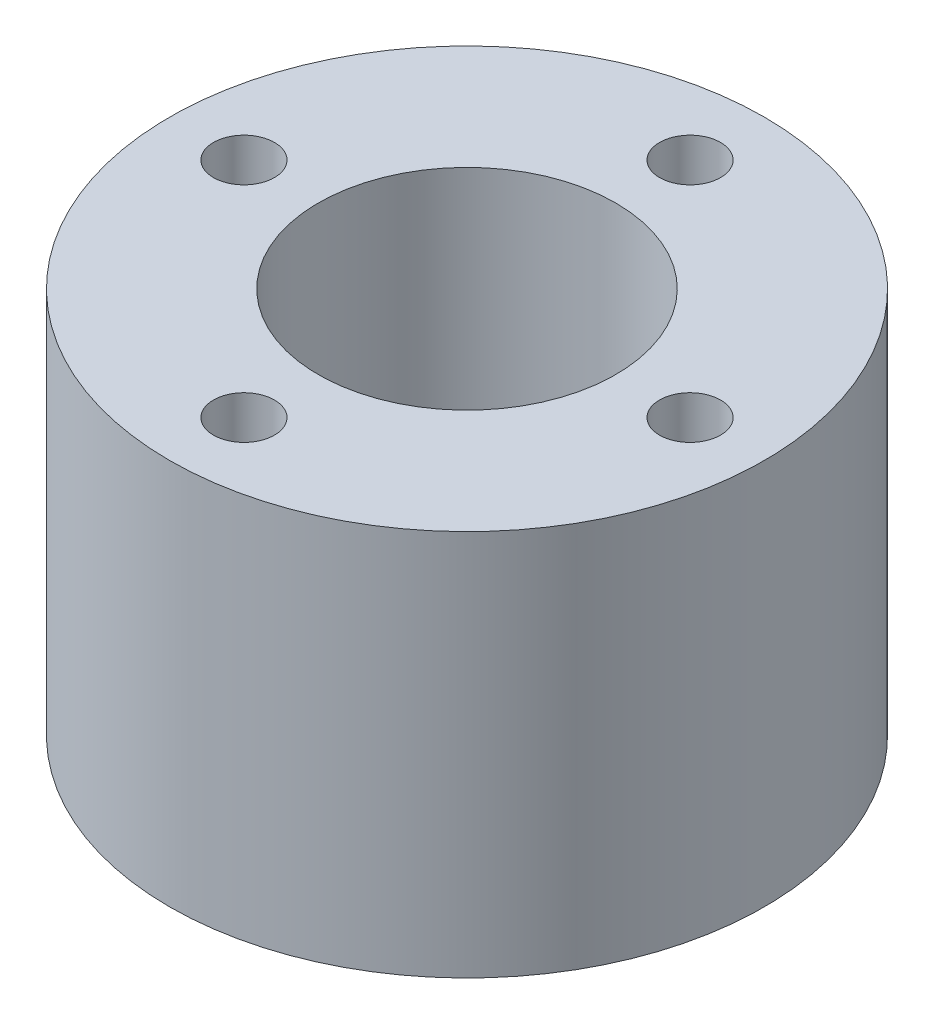
ISO-10303-21;
HEADER;
FILE_DESCRIPTION(('STEP AP214'),'2;1');
FILE_NAME('part.step','',(''),(''),'','','');
FILE_SCHEMA(('AUTOMOTIVE_DESIGN { 1 0 10303 214 1 1 1 1 }'));
ENDSEC;
DATA;
#1=APPLICATION_CONTEXT('core data for automotive mechanical design processes');
#2=APPLICATION_PROTOCOL_DEFINITION('international standard','automotive_design',2000,#1);
#3=PRODUCT_CONTEXT('',#1,'mechanical');
#4=PRODUCT('Part','Part','',(#3));
#5=PRODUCT_RELATED_PRODUCT_CATEGORY('part','',(#4));
#6=PRODUCT_DEFINITION_FORMATION('','',#4);
#7=PRODUCT_DEFINITION_CONTEXT('part definition',#1,'design');
#8=PRODUCT_DEFINITION('design','',#6,#7);
#9=PRODUCT_DEFINITION_SHAPE('','',#8);
#10=(LENGTH_UNIT() NAMED_UNIT(*) SI_UNIT(.MILLI.,.METRE.));
#11=(NAMED_UNIT(*) PLANE_ANGLE_UNIT() SI_UNIT($,.RADIAN.));
#12=(NAMED_UNIT(*) SI_UNIT($,.STERADIAN.) SOLID_ANGLE_UNIT());
#13=UNCERTAINTY_MEASURE_WITH_UNIT(LENGTH_MEASURE(1.E-05),#10,'distance_accuracy_value','');
#14=(GEOMETRIC_REPRESENTATION_CONTEXT(3) GLOBAL_UNCERTAINTY_ASSIGNED_CONTEXT((#13)) GLOBAL_UNIT_ASSIGNED_CONTEXT((#10,
#11,#12)) REPRESENTATION_CONTEXT('',''));
#15=CARTESIAN_POINT('',(0.,0.,0.));
#16=DIRECTION('',(0.,0.,1.));
#17=DIRECTION('',(1.,0.,0.));
#18=AXIS2_PLACEMENT_3D('',#15,#16,#17);
#19=CARTESIAN_POINT('',(-7.5,0.999999999999998,0.));
#20=DIRECTION('',(0.,-1.,0.));
#21=DIRECTION('',(0.,0.,-1.));
#22=AXIS2_PLACEMENT_3D('',#19,#20,#21);
#23=PLANE('',#22);
#24=CARTESIAN_POINT('',(-7.5,0.999999999999999,0.));
#25=DIRECTION('',(0.,1.,0.));
#26=DIRECTION('',(0.,0.,1.));
#27=AXIS2_PLACEMENT_3D('',#24,#25,#26);
#28=CIRCLE('',#27,1.025);
#29=CARTESIAN_POINT('',(-7.5,0.999999999999999,1.025));
#30=VERTEX_POINT('',#29);
#31=EDGE_CURVE('E17',#30,#30,#28,.T.);
#32=ORIENTED_EDGE('',*,*,#31,.T.);
#33=EDGE_LOOP('',(#32));
#34=FACE_BOUND('',#33,.T.);
#35=ADVANCED_FACE('F14',(#34),#23,.F.);
#36=CARTESIAN_POINT('',(0.,0.999999999999998,7.5));
#37=DIRECTION('',(0.,-1.,0.));
#38=DIRECTION('',(0.,0.,-1.));
#39=AXIS2_PLACEMENT_3D('',#36,#37,#38);
#40=PLANE('',#39);
#41=CARTESIAN_POINT('',(0.,0.999999999999999,7.5));
#42=DIRECTION('',(0.,1.,0.));
#43=DIRECTION('',(0.,0.,1.));
#44=AXIS2_PLACEMENT_3D('',#41,#42,#43);
#45=CIRCLE('',#44,1.025);
#46=CARTESIAN_POINT('',(0.,0.999999999999999,8.525));
#47=VERTEX_POINT('',#46);
#48=EDGE_CURVE('E51',#47,#47,#45,.T.);
#49=ORIENTED_EDGE('',*,*,#48,.T.);
#50=EDGE_LOOP('',(#49));
#51=FACE_BOUND('',#50,.T.);
#52=ADVANCED_FACE('F109',(#51),#40,.F.);
#53=CARTESIAN_POINT('',(7.5,0.999999999999998,0.));
#54=DIRECTION('',(0.,-1.,0.));
#55=DIRECTION('',(0.,0.,-1.));
#56=AXIS2_PLACEMENT_3D('',#53,#54,#55);
#57=PLANE('',#56);
#58=CARTESIAN_POINT('',(7.5,0.999999999999999,0.));
#59=DIRECTION('',(0.,1.,0.));
#60=DIRECTION('',(0.,0.,1.));
#61=AXIS2_PLACEMENT_3D('',#58,#59,#60);
#62=CIRCLE('',#61,1.025);
#63=CARTESIAN_POINT('',(7.5,0.999999999999999,1.025));
#64=VERTEX_POINT('',#63);
#65=EDGE_CURVE('E49',#64,#64,#62,.T.);
#66=ORIENTED_EDGE('',*,*,#65,.T.);
#67=EDGE_LOOP('',(#66));
#68=FACE_BOUND('',#67,.T.);
#69=ADVANCED_FACE('F73',(#68),#57,.F.);
#70=CARTESIAN_POINT('',(0.,0.999999999999998,-7.5));
#71=DIRECTION('',(0.,-1.,0.));
#72=DIRECTION('',(0.,0.,-1.));
#73=AXIS2_PLACEMENT_3D('',#70,#71,#72);
#74=PLANE('',#73);
#75=CARTESIAN_POINT('',(0.,0.999999999999999,-7.5));
#76=DIRECTION('',(0.,1.,0.));
#77=DIRECTION('',(0.,0.,1.));
#78=AXIS2_PLACEMENT_3D('',#75,#76,#77);
#79=CIRCLE('',#78,1.025);
#80=CARTESIAN_POINT('',(0.,0.999999999999999,-6.475));
#81=VERTEX_POINT('',#80);
#82=EDGE_CURVE('E46',#81,#81,#79,.T.);
#83=ORIENTED_EDGE('',*,*,#82,.T.);
#84=EDGE_LOOP('',(#83));
#85=FACE_BOUND('',#84,.T.);
#86=ADVANCED_FACE('F62',(#85),#74,.F.);
#87=CARTESIAN_POINT('',(-7.5,13.,0.));
#88=DIRECTION('',(0.,1.,0.));
#89=DIRECTION('',(0.,0.,1.));
#90=AXIS2_PLACEMENT_3D('',#87,#88,#89);
#91=CYLINDRICAL_SURFACE('',#90,1.025);
#92=CARTESIAN_POINT('',(-7.5,13.,0.));
#93=DIRECTION('',(0.,1.,0.));
#94=DIRECTION('',(0.,0.,1.));
#95=AXIS2_PLACEMENT_3D('',#92,#93,#94);
#96=CIRCLE('',#95,1.025);
#97=CARTESIAN_POINT('',(-7.5,13.,1.025));
#98=VERTEX_POINT('',#97);
#99=EDGE_CURVE('E43',#98,#98,#96,.F.);
#100=ORIENTED_EDGE('',*,*,#99,.F.);
#101=EDGE_LOOP('',(#100));
#102=FACE_BOUND('',#101,.T.);
#103=ORIENTED_EDGE('',*,*,#31,.F.);
#104=EDGE_LOOP('',(#103));
#105=FACE_BOUND('',#104,.T.);
#106=ADVANCED_FACE('F59',(#102,#105),#91,.F.);
#107=CARTESIAN_POINT('',(0.,13.,7.5));
#108=DIRECTION('',(0.,1.,0.));
#109=DIRECTION('',(0.,0.,1.));
#110=AXIS2_PLACEMENT_3D('',#107,#108,#109);
#111=CYLINDRICAL_SURFACE('',#110,1.025);
#112=CARTESIAN_POINT('',(0.,13.,7.5));
#113=DIRECTION('',(0.,1.,0.));
#114=DIRECTION('',(0.,0.,1.));
#115=AXIS2_PLACEMENT_3D('',#112,#113,#114);
#116=CIRCLE('',#115,1.025);
#117=CARTESIAN_POINT('',(0.,13.,8.525));
#118=VERTEX_POINT('',#117);
#119=EDGE_CURVE('E40',#118,#118,#116,.F.);
#120=ORIENTED_EDGE('',*,*,#119,.F.);
#121=EDGE_LOOP('',(#120));
#122=FACE_BOUND('',#121,.T.);
#123=ORIENTED_EDGE('',*,*,#48,.F.);
#124=EDGE_LOOP('',(#123));
#125=FACE_BOUND('',#124,.T.);
#126=ADVANCED_FACE('F61',(#122,#125),#111,.F.);
#127=CARTESIAN_POINT('',(7.5,13.,0.));
#128=DIRECTION('',(0.,1.,0.));
#129=DIRECTION('',(0.,0.,1.));
#130=AXIS2_PLACEMENT_3D('',#127,#128,#129);
#131=CYLINDRICAL_SURFACE('',#130,1.025);
#132=CARTESIAN_POINT('',(7.5,13.,0.));
#133=DIRECTION('',(0.,1.,0.));
#134=DIRECTION('',(0.,0.,1.));
#135=AXIS2_PLACEMENT_3D('',#132,#133,#134);
#136=CIRCLE('',#135,1.025);
#137=CARTESIAN_POINT('',(7.5,13.,1.025));
#138=VERTEX_POINT('',#137);
#139=EDGE_CURVE('E37',#138,#138,#136,.F.);
#140=ORIENTED_EDGE('',*,*,#139,.F.);
#141=EDGE_LOOP('',(#140));
#142=FACE_BOUND('',#141,.T.);
#143=ORIENTED_EDGE('',*,*,#65,.F.);
#144=EDGE_LOOP('',(#143));
#145=FACE_BOUND('',#144,.T.);
#146=ADVANCED_FACE('F70',(#142,#145),#131,.F.);
#147=CARTESIAN_POINT('',(0.,13.,-7.5));
#148=DIRECTION('',(0.,1.,0.));
#149=DIRECTION('',(0.,0.,1.));
#150=AXIS2_PLACEMENT_3D('',#147,#148,#149);
#151=CYLINDRICAL_SURFACE('',#150,1.025);
#152=CARTESIAN_POINT('',(0.,13.,-7.5));
#153=DIRECTION('',(0.,1.,0.));
#154=DIRECTION('',(0.,0.,1.));
#155=AXIS2_PLACEMENT_3D('',#152,#153,#154);
#156=CIRCLE('',#155,1.025);
#157=CARTESIAN_POINT('',(0.,13.,-6.475));
#158=VERTEX_POINT('',#157);
#159=EDGE_CURVE('E34',#158,#158,#156,.F.);
#160=ORIENTED_EDGE('',*,*,#159,.F.);
#161=EDGE_LOOP('',(#160));
#162=FACE_BOUND('',#161,.T.);
#163=ORIENTED_EDGE('',*,*,#82,.F.);
#164=EDGE_LOOP('',(#163));
#165=FACE_BOUND('',#164,.T.);
#166=ADVANCED_FACE('F95',(#162,#165),#151,.F.);
#167=CARTESIAN_POINT('',(0.,13.,0.));
#168=DIRECTION('',(0.,-1.,0.));
#169=DIRECTION('',(0.,0.,-1.));
#170=AXIS2_PLACEMENT_3D('',#167,#168,#169);
#171=CYLINDRICAL_SURFACE('',#170,5.);
#172=CARTESIAN_POINT('',(0.,0.,0.));
#173=DIRECTION('',(0.,-1.,0.));
#174=DIRECTION('',(0.,0.,-1.));
#175=AXIS2_PLACEMENT_3D('',#172,#173,#174);
#176=CIRCLE('',#175,5.);
#177=CARTESIAN_POINT('',(0.,0.,-5.));
#178=VERTEX_POINT('',#177);
#179=EDGE_CURVE('E26',#178,#178,#176,.T.);
#180=ORIENTED_EDGE('',*,*,#179,.T.);
#181=EDGE_LOOP('',(#180));
#182=FACE_BOUND('',#181,.T.);
#183=CARTESIAN_POINT('',(0.,13.,0.));
#184=DIRECTION('',(0.,-1.,0.));
#185=DIRECTION('',(0.,0.,-1.));
#186=AXIS2_PLACEMENT_3D('',#183,#184,#185);
#187=CIRCLE('',#186,5.);
#188=CARTESIAN_POINT('',(0.,13.,-5.));
#189=VERTEX_POINT('',#188);
#190=EDGE_CURVE('E31',#189,#189,#187,.T.);
#191=ORIENTED_EDGE('',*,*,#190,.F.);
#192=EDGE_LOOP('',(#191));
#193=FACE_BOUND('',#192,.T.);
#194=ADVANCED_FACE('F91',(#182,#193),#171,.F.);
#195=CARTESIAN_POINT('',(0.,13.,0.));
#196=DIRECTION('',(0.,1.,0.));
#197=DIRECTION('',(0.,0.,1.));
#198=AXIS2_PLACEMENT_3D('',#195,#196,#197);
#199=PLANE('',#198);
#200=ORIENTED_EDGE('',*,*,#190,.T.);
#201=EDGE_LOOP('',(#200));
#202=FACE_BOUND('',#201,.T.);
#203=CARTESIAN_POINT('',(0.,13.,0.));
#204=DIRECTION('',(0.,-1.,0.));
#205=DIRECTION('',(0.,0.,-1.));
#206=AXIS2_PLACEMENT_3D('',#203,#204,#205);
#207=CIRCLE('',#206,10.);
#208=CARTESIAN_POINT('',(0.,13.,-10.));
#209=VERTEX_POINT('',#208);
#210=EDGE_CURVE('E21',#209,#209,#207,.T.);
#211=ORIENTED_EDGE('',*,*,#210,.F.);
#212=EDGE_LOOP('',(#211));
#213=FACE_BOUND('',#212,.T.);
#214=ORIENTED_EDGE('',*,*,#159,.T.);
#215=EDGE_LOOP('',(#214));
#216=FACE_BOUND('',#215,.T.);
#217=ORIENTED_EDGE('',*,*,#139,.T.);
#218=EDGE_LOOP('',(#217));
#219=FACE_BOUND('',#218,.T.);
#220=ORIENTED_EDGE('',*,*,#119,.T.);
#221=EDGE_LOOP('',(#220));
#222=FACE_BOUND('',#221,.T.);
#223=ORIENTED_EDGE('',*,*,#99,.T.);
#224=EDGE_LOOP('',(#223));
#225=FACE_BOUND('',#224,.T.);
#226=ADVANCED_FACE('F84',(#202,#213,#216,#219,#222,#225),#199,.T.);
#227=CARTESIAN_POINT('',(0.,0.,0.));
#228=DIRECTION('',(0.,1.,0.));
#229=DIRECTION('',(0.,0.,1.));
#230=AXIS2_PLACEMENT_3D('',#227,#228,#229);
#231=PLANE('',#230);
#232=ORIENTED_EDGE('',*,*,#179,.F.);
#233=EDGE_LOOP('',(#232));
#234=FACE_BOUND('',#233,.T.);
#235=CARTESIAN_POINT('',(0.,0.,0.));
#236=DIRECTION('',(0.,-1.,0.));
#237=DIRECTION('',(0.,0.,-1.));
#238=AXIS2_PLACEMENT_3D('',#235,#236,#237);
#239=CIRCLE('',#238,10.);
#240=CARTESIAN_POINT('',(0.,0.,-10.));
#241=VERTEX_POINT('',#240);
#242=EDGE_CURVE('E10',#241,#241,#239,.F.);
#243=ORIENTED_EDGE('',*,*,#242,.F.);
#244=EDGE_LOOP('',(#243));
#245=FACE_BOUND('',#244,.T.);
#246=ADVANCED_FACE('F79',(#234,#245),#231,.F.);
#247=CARTESIAN_POINT('',(0.,13.,0.));
#248=DIRECTION('',(0.,-1.,0.));
#249=DIRECTION('',(0.,0.,-1.));
#250=AXIS2_PLACEMENT_3D('',#247,#248,#249);
#251=CYLINDRICAL_SURFACE('',#250,10.);
#252=ORIENTED_EDGE('',*,*,#242,.T.);
#253=EDGE_LOOP('',(#252));
#254=FACE_BOUND('',#253,.T.);
#255=ORIENTED_EDGE('',*,*,#210,.T.);
#256=EDGE_LOOP('',(#255));
#257=FACE_BOUND('',#256,.T.);
#258=ADVANCED_FACE('F77',(#254,#257),#251,.T.);
#259=CLOSED_SHELL('',(#35,#52,#69,#86,#106,#126,#146,#166,#194,#226,#246,#258));
#260=MANIFOLD_SOLID_BREP('B1',#259);
#261=ADVANCED_BREP_SHAPE_REPRESENTATION('',(#18,#260),#14);
#262=SHAPE_DEFINITION_REPRESENTATION(#9,#261);
ENDSEC;
END-ISO-10303-21;
